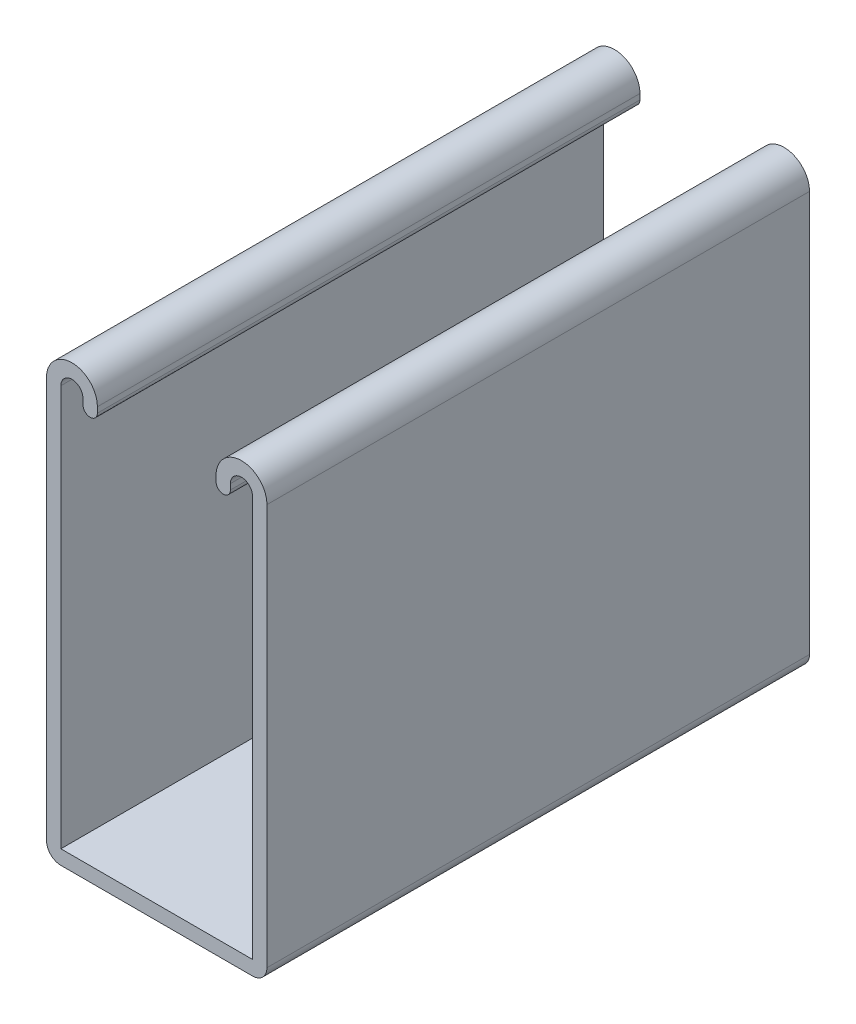
ISO-10303-21;
HEADER;
FILE_DESCRIPTION(('STEP AP214'),'2;1');
FILE_NAME('part.step','',(''),(''),'','','');
FILE_SCHEMA(('AUTOMOTIVE_DESIGN { 1 0 10303 214 1 1 1 1 }'));
ENDSEC;
DATA;
#1=APPLICATION_CONTEXT('core data for automotive mechanical design processes');
#2=APPLICATION_PROTOCOL_DEFINITION('international standard','automotive_design',2000,#1);
#3=PRODUCT_CONTEXT('',#1,'mechanical');
#4=PRODUCT('Part','Part','',(#3));
#5=PRODUCT_RELATED_PRODUCT_CATEGORY('part','',(#4));
#6=PRODUCT_DEFINITION_FORMATION('','',#4);
#7=PRODUCT_DEFINITION_CONTEXT('part definition',#1,'design');
#8=PRODUCT_DEFINITION('design','',#6,#7);
#9=PRODUCT_DEFINITION_SHAPE('','',#8);
#10=(LENGTH_UNIT() NAMED_UNIT(*) SI_UNIT(.MILLI.,.METRE.));
#11=(NAMED_UNIT(*) PLANE_ANGLE_UNIT() SI_UNIT($,.RADIAN.));
#12=(NAMED_UNIT(*) SI_UNIT($,.STERADIAN.) SOLID_ANGLE_UNIT());
#13=UNCERTAINTY_MEASURE_WITH_UNIT(LENGTH_MEASURE(1.E-05),#10,'distance_accuracy_value','');
#14=(GEOMETRIC_REPRESENTATION_CONTEXT(3) GLOBAL_UNCERTAINTY_ASSIGNED_CONTEXT((#13)) GLOBAL_UNIT_ASSIGNED_CONTEXT((#10,
#11,#12)) REPRESENTATION_CONTEXT('',''));
#15=CARTESIAN_POINT('',(0.,0.,0.));
#16=DIRECTION('',(0.,0.,1.));
#17=DIRECTION('',(1.,0.,0.));
#18=AXIS2_PLACEMENT_3D('',#15,#16,#17);
#19=CARTESIAN_POINT('',(-15.875,39.6875,101.6));
#20=DIRECTION('',(0.,0.,-1.));
#21=DIRECTION('',(-1.,0.,0.));
#22=AXIS2_PLACEMENT_3D('',#19,#20,#21);
#23=CYLINDRICAL_SURFACE('',#22,4.7625);
#24=CARTESIAN_POINT('',(-15.875,39.6875,0.));
#25=DIRECTION('',(0.,0.,1.));
#26=DIRECTION('',(-1.,0.,0.));
#27=AXIS2_PLACEMENT_3D('',#24,#25,#26);
#28=CIRCLE('',#27,4.7625);
#29=CARTESIAN_POINT('',(-11.1125,39.6875,0.));
#30=VERTEX_POINT('',#29);
#31=CARTESIAN_POINT('',(-20.6375,39.6875,0.));
#32=VERTEX_POINT('',#31);
#33=EDGE_CURVE('E189',#30,#32,#28,.T.);
#34=ORIENTED_EDGE('',*,*,#33,.T.);
#35=DIRECTION('',(0.,0.,-1.));
#36=VECTOR('',#35,1.);
#37=CARTESIAN_POINT('',(-20.6375,39.6875,101.6));
#38=LINE('',#37,#36);
#39=CARTESIAN_POINT('',(-20.6375,39.6875,101.6));
#40=VERTEX_POINT('',#39);
#41=EDGE_CURVE('E11',#40,#32,#38,.T.);
#42=ORIENTED_EDGE('',*,*,#41,.F.);
#43=CARTESIAN_POINT('',(-15.875,39.6875,101.6));
#44=DIRECTION('',(0.,0.,1.));
#45=DIRECTION('',(-1.,0.,0.));
#46=AXIS2_PLACEMENT_3D('',#43,#44,#45);
#47=CIRCLE('',#46,4.7625);
#48=CARTESIAN_POINT('',(-11.1125,39.6875,101.6));
#49=VERTEX_POINT('',#48);
#50=EDGE_CURVE('E223',#49,#40,#47,.T.);
#51=ORIENTED_EDGE('',*,*,#50,.F.);
#52=DIRECTION('',(0.,0.,-1.));
#53=VECTOR('',#52,1.);
#54=CARTESIAN_POINT('',(-11.1125,39.6875,101.6));
#55=LINE('',#54,#53);
#56=EDGE_CURVE('E185',#49,#30,#55,.T.);
#57=ORIENTED_EDGE('',*,*,#56,.T.);
#58=EDGE_LOOP('',(#34,#42,#51,#57));
#59=FACE_BOUND('',#58,.T.);
#60=ADVANCED_FACE('F32',(#59),#23,.T.);
#61=CARTESIAN_POINT('',(-20.6375,39.6875,101.6));
#62=DIRECTION('',(1.,0.,0.));
#63=DIRECTION('',(0.,1.,0.));
#64=AXIS2_PLACEMENT_3D('',#61,#62,#63);
#65=PLANE('',#64);
#66=DIRECTION('',(0.,-1.,0.));
#67=VECTOR('',#66,1.);
#68=CARTESIAN_POINT('',(-20.6375,39.6875,0.));
#69=LINE('',#68,#67);
#70=CARTESIAN_POINT('',(-20.6375,-35.4076,0.));
#71=VERTEX_POINT('',#70);
#72=EDGE_CURVE('E192',#32,#71,#69,.T.);
#73=ORIENTED_EDGE('',*,*,#72,.T.);
#74=DIRECTION('',(0.,0.,-1.));
#75=VECTOR('',#74,1.);
#76=CARTESIAN_POINT('',(-20.6375,-35.4076,101.6));
#77=LINE('',#76,#75);
#78=CARTESIAN_POINT('',(-20.6375,-35.4076,101.6));
#79=VERTEX_POINT('',#78);
#80=EDGE_CURVE('E41',#79,#71,#77,.T.);
#81=ORIENTED_EDGE('',*,*,#80,.F.);
#82=DIRECTION('',(0.,-1.,0.));
#83=VECTOR('',#82,1.);
#84=CARTESIAN_POINT('',(-20.6375,39.6875,101.6));
#85=LINE('',#84,#83);
#86=EDGE_CURVE('E122',#40,#79,#85,.T.);
#87=ORIENTED_EDGE('',*,*,#86,.F.);
#88=ORIENTED_EDGE('',*,*,#41,.T.);
#89=EDGE_LOOP('',(#73,#81,#87,#88));
#90=FACE_BOUND('',#89,.T.);
#91=ADVANCED_FACE('F332',(#90),#65,.F.);
#92=CARTESIAN_POINT('',(-17.9451,-35.4076,101.6));
#93=DIRECTION('',(0.,0.,-1.));
#94=DIRECTION('',(-1.,0.,0.));
#95=AXIS2_PLACEMENT_3D('',#92,#93,#94);
#96=CYLINDRICAL_SURFACE('',#95,2.6924);
#97=CARTESIAN_POINT('',(-17.9451,-35.4076,0.));
#98=DIRECTION('',(0.,0.,1.));
#99=DIRECTION('',(-1.,0.,0.));
#100=AXIS2_PLACEMENT_3D('',#97,#98,#99);
#101=CIRCLE('',#100,2.6924);
#102=CARTESIAN_POINT('',(-17.9451,-38.1,0.));
#103=VERTEX_POINT('',#102);
#104=EDGE_CURVE('E194',#71,#103,#101,.T.);
#105=ORIENTED_EDGE('',*,*,#104,.T.);
#106=DIRECTION('',(0.,0.,-1.));
#107=VECTOR('',#106,1.);
#108=CARTESIAN_POINT('',(-17.9451,-38.1,101.6));
#109=LINE('',#108,#107);
#110=CARTESIAN_POINT('',(-17.9451,-38.1,101.6));
#111=VERTEX_POINT('',#110);
#112=EDGE_CURVE('E260',#111,#103,#109,.T.);
#113=ORIENTED_EDGE('',*,*,#112,.F.);
#114=CARTESIAN_POINT('',(-17.9451,-35.4076,101.6));
#115=DIRECTION('',(0.,0.,1.));
#116=DIRECTION('',(-1.,0.,0.));
#117=AXIS2_PLACEMENT_3D('',#114,#115,#116);
#118=CIRCLE('',#117,2.6924);
#119=EDGE_CURVE('E269',#79,#111,#118,.T.);
#120=ORIENTED_EDGE('',*,*,#119,.F.);
#121=ORIENTED_EDGE('',*,*,#80,.T.);
#122=EDGE_LOOP('',(#105,#113,#120,#121));
#123=FACE_BOUND('',#122,.T.);
#124=ADVANCED_FACE('F267',(#123),#96,.T.);
#125=CARTESIAN_POINT('',(-17.9451,-38.1,101.6));
#126=DIRECTION('',(0.,1.,0.));
#127=DIRECTION('',(-1.,0.,0.));
#128=AXIS2_PLACEMENT_3D('',#125,#126,#127);
#129=PLANE('',#128);
#130=CARTESIAN_POINT('',(0.,-38.1,71.4375));
#131=DIRECTION('',(0.,-1.,0.));
#132=DIRECTION('',(1.,0.,0.));
#133=AXIS2_PLACEMENT_3D('',#130,#131,#132);
#134=CIRCLE('',#133,7.14375);
#135=CARTESIAN_POINT('',(7.14374999999999,-38.1,71.4375));
#136=VERTEX_POINT('',#135);
#137=EDGE_CURVE('E451',#136,#136,#134,.T.);
#138=ORIENTED_EDGE('',*,*,#137,.F.);
#139=EDGE_LOOP('',(#138));
#140=FACE_BOUND('',#139,.T.);
#141=CARTESIAN_POINT('',(0.,-38.1,23.8125));
#142=DIRECTION('',(0.,-1.,0.));
#143=DIRECTION('',(1.,0.,0.));
#144=AXIS2_PLACEMENT_3D('',#141,#142,#143);
#145=CIRCLE('',#144,7.14375);
#146=CARTESIAN_POINT('',(7.14374999999999,-38.1,23.8125));
#147=VERTEX_POINT('',#146);
#148=EDGE_CURVE('E455',#147,#147,#145,.T.);
#149=ORIENTED_EDGE('',*,*,#148,.F.);
#150=EDGE_LOOP('',(#149));
#151=FACE_BOUND('',#150,.T.);
#152=DIRECTION('',(1.,0.,0.));
#153=VECTOR('',#152,1.);
#154=CARTESIAN_POINT('',(-17.9451,-38.1,0.));
#155=LINE('',#154,#153);
#156=CARTESIAN_POINT('',(17.9451,-38.1,0.));
#157=VERTEX_POINT('',#156);
#158=EDGE_CURVE('E196',#103,#157,#155,.T.);
#159=ORIENTED_EDGE('',*,*,#158,.T.);
#160=DIRECTION('',(0.,0.,-1.));
#161=VECTOR('',#160,1.);
#162=CARTESIAN_POINT('',(17.9451,-38.1,101.6));
#163=LINE('',#162,#161);
#164=CARTESIAN_POINT('',(17.9451,-38.1,101.6));
#165=VERTEX_POINT('',#164);
#166=EDGE_CURVE('E257',#165,#157,#163,.T.);
#167=ORIENTED_EDGE('',*,*,#166,.F.);
#168=DIRECTION('',(1.,0.,0.));
#169=VECTOR('',#168,1.);
#170=CARTESIAN_POINT('',(-17.9451,-38.1,101.6));
#171=LINE('',#170,#169);
#172=EDGE_CURVE('E287',#111,#165,#171,.T.);
#173=ORIENTED_EDGE('',*,*,#172,.F.);
#174=ORIENTED_EDGE('',*,*,#112,.T.);
#175=EDGE_LOOP('',(#159,#167,#173,#174));
#176=FACE_BOUND('',#175,.T.);
#177=ADVANCED_FACE('F278',(#140,#151,#176),#129,.F.);
#178=CARTESIAN_POINT('',(17.9451,-35.4076,101.6));
#179=DIRECTION('',(0.,0.,-1.));
#180=DIRECTION('',(-1.,0.,0.));
#181=AXIS2_PLACEMENT_3D('',#178,#179,#180);
#182=CYLINDRICAL_SURFACE('',#181,2.6924);
#183=CARTESIAN_POINT('',(17.9451,-35.4076,0.));
#184=DIRECTION('',(0.,0.,1.));
#185=DIRECTION('',(1.,0.,0.));
#186=AXIS2_PLACEMENT_3D('',#183,#184,#185);
#187=CIRCLE('',#186,2.6924);
#188=CARTESIAN_POINT('',(20.6375,-35.4076,0.));
#189=VERTEX_POINT('',#188);
#190=EDGE_CURVE('E198',#157,#189,#187,.T.);
#191=ORIENTED_EDGE('',*,*,#190,.T.);
#192=DIRECTION('',(0.,0.,-1.));
#193=VECTOR('',#192,1.);
#194=CARTESIAN_POINT('',(20.6375,-35.4076,101.6));
#195=LINE('',#194,#193);
#196=CARTESIAN_POINT('',(20.6375,-35.4076,101.6));
#197=VERTEX_POINT('',#196);
#198=EDGE_CURVE('E254',#197,#189,#195,.T.);
#199=ORIENTED_EDGE('',*,*,#198,.F.);
#200=CARTESIAN_POINT('',(17.9451,-35.4076,101.6));
#201=DIRECTION('',(0.,0.,1.));
#202=DIRECTION('',(1.,0.,0.));
#203=AXIS2_PLACEMENT_3D('',#200,#201,#202);
#204=CIRCLE('',#203,2.6924);
#205=EDGE_CURVE('E284',#165,#197,#204,.T.);
#206=ORIENTED_EDGE('',*,*,#205,.F.);
#207=ORIENTED_EDGE('',*,*,#166,.T.);
#208=EDGE_LOOP('',(#191,#199,#206,#207));
#209=FACE_BOUND('',#208,.T.);
#210=ADVANCED_FACE('F282',(#209),#182,.T.);
#211=CARTESIAN_POINT('',(20.6375,-35.4076,101.6));
#212=DIRECTION('',(-1.,0.,0.));
#213=DIRECTION('',(0.,-1.,0.));
#214=AXIS2_PLACEMENT_3D('',#211,#212,#213);
#215=PLANE('',#214);
#216=DIRECTION('',(0.,1.,0.));
#217=VECTOR('',#216,1.);
#218=CARTESIAN_POINT('',(20.6375,-35.4076,0.));
#219=LINE('',#218,#217);
#220=CARTESIAN_POINT('',(20.6375,39.6875,0.));
#221=VERTEX_POINT('',#220);
#222=EDGE_CURVE('E200',#189,#221,#219,.T.);
#223=ORIENTED_EDGE('',*,*,#222,.T.);
#224=DIRECTION('',(0.,0.,-1.));
#225=VECTOR('',#224,1.);
#226=CARTESIAN_POINT('',(20.6375,39.6875,101.6));
#227=LINE('',#226,#225);
#228=CARTESIAN_POINT('',(20.6375,39.6875,101.6));
#229=VERTEX_POINT('',#228);
#230=EDGE_CURVE('E251',#229,#221,#227,.T.);
#231=ORIENTED_EDGE('',*,*,#230,.F.);
#232=DIRECTION('',(0.,1.,0.));
#233=VECTOR('',#232,1.);
#234=CARTESIAN_POINT('',(20.6375,-35.4076,101.6));
#235=LINE('',#234,#233);
#236=EDGE_CURVE('E286',#197,#229,#235,.T.);
#237=ORIENTED_EDGE('',*,*,#236,.F.);
#238=ORIENTED_EDGE('',*,*,#198,.T.);
#239=EDGE_LOOP('',(#223,#231,#237,#238));
#240=FACE_BOUND('',#239,.T.);
#241=ADVANCED_FACE('F346',(#240),#215,.F.);
#242=CARTESIAN_POINT('',(15.875,39.6875,101.6));
#243=DIRECTION('',(0.,0.,-1.));
#244=DIRECTION('',(-1.,0.,0.));
#245=AXIS2_PLACEMENT_3D('',#242,#243,#244);
#246=CYLINDRICAL_SURFACE('',#245,4.7625);
#247=CARTESIAN_POINT('',(15.875,39.6875,0.));
#248=DIRECTION('',(0.,0.,1.));
#249=DIRECTION('',(1.,0.,0.));
#250=AXIS2_PLACEMENT_3D('',#247,#248,#249);
#251=CIRCLE('',#250,4.7625);
#252=CARTESIAN_POINT('',(11.1125,39.6875,0.));
#253=VERTEX_POINT('',#252);
#254=EDGE_CURVE('E202',#221,#253,#251,.T.);
#255=ORIENTED_EDGE('',*,*,#254,.T.);
#256=DIRECTION('',(0.,0.,-1.));
#257=VECTOR('',#256,1.);
#258=CARTESIAN_POINT('',(11.1125,39.6875,101.6));
#259=LINE('',#258,#257);
#260=CARTESIAN_POINT('',(11.1125,39.6875,101.6));
#261=VERTEX_POINT('',#260);
#262=EDGE_CURVE('E248',#261,#253,#259,.T.);
#263=ORIENTED_EDGE('',*,*,#262,.F.);
#264=CARTESIAN_POINT('',(15.875,39.6875,101.6));
#265=DIRECTION('',(0.,0.,1.));
#266=DIRECTION('',(1.,0.,0.));
#267=AXIS2_PLACEMENT_3D('',#264,#265,#266);
#268=CIRCLE('',#267,4.7625);
#269=EDGE_CURVE('E289',#229,#261,#268,.T.);
#270=ORIENTED_EDGE('',*,*,#269,.F.);
#271=ORIENTED_EDGE('',*,*,#230,.T.);
#272=EDGE_LOOP('',(#255,#263,#270,#271));
#273=FACE_BOUND('',#272,.T.);
#274=ADVANCED_FACE('F349',(#273),#246,.T.);
#275=CARTESIAN_POINT('',(11.1125,39.6875,101.6));
#276=DIRECTION('',(1.,0.,0.));
#277=DIRECTION('',(0.,1.,0.));
#278=AXIS2_PLACEMENT_3D('',#275,#276,#277);
#279=PLANE('',#278);
#280=DIRECTION('',(0.,-1.,0.));
#281=VECTOR('',#280,1.);
#282=CARTESIAN_POINT('',(11.1125,39.6875,0.));
#283=LINE('',#282,#281);
#284=CARTESIAN_POINT('',(11.1125,38.65245,0.));
#285=VERTEX_POINT('',#284);
#286=EDGE_CURVE('E204',#253,#285,#283,.T.);
#287=ORIENTED_EDGE('',*,*,#286,.T.);
#288=DIRECTION('',(0.,0.,-1.));
#289=VECTOR('',#288,1.);
#290=CARTESIAN_POINT('',(11.1125,38.65245,101.6));
#291=LINE('',#290,#289);
#292=CARTESIAN_POINT('',(11.1125,38.65245,101.6));
#293=VERTEX_POINT('',#292);
#294=EDGE_CURVE('E245',#293,#285,#291,.T.);
#295=ORIENTED_EDGE('',*,*,#294,.F.);
#296=DIRECTION('',(0.,-1.,0.));
#297=VECTOR('',#296,1.);
#298=CARTESIAN_POINT('',(11.1125,39.6875,101.6));
#299=LINE('',#298,#297);
#300=EDGE_CURVE('E295',#261,#293,#299,.T.);
#301=ORIENTED_EDGE('',*,*,#300,.F.);
#302=ORIENTED_EDGE('',*,*,#262,.T.);
#303=EDGE_LOOP('',(#287,#295,#301,#302));
#304=FACE_BOUND('',#303,.T.);
#305=ADVANCED_FACE('F353',(#304),#279,.F.);
#306=CARTESIAN_POINT('',(12.4587,38.65245,101.6));
#307=DIRECTION('',(0.,0.,-1.));
#308=DIRECTION('',(-1.,0.,0.));
#309=AXIS2_PLACEMENT_3D('',#306,#307,#308);
#310=CYLINDRICAL_SURFACE('',#309,1.3462);
#311=CARTESIAN_POINT('',(12.4587,38.65245,0.));
#312=DIRECTION('',(0.,0.,1.));
#313=DIRECTION('',(1.,0.,0.));
#314=AXIS2_PLACEMENT_3D('',#311,#312,#313);
#315=CIRCLE('',#314,1.3462);
#316=CARTESIAN_POINT('',(13.8049,38.65245,0.));
#317=VERTEX_POINT('',#316);
#318=EDGE_CURVE('E206',#285,#317,#315,.T.);
#319=ORIENTED_EDGE('',*,*,#318,.T.);
#320=DIRECTION('',(0.,0.,-1.));
#321=VECTOR('',#320,1.);
#322=CARTESIAN_POINT('',(13.8049,38.65245,101.6));
#323=LINE('',#322,#321);
#324=CARTESIAN_POINT('',(13.8049,38.65245,101.6));
#325=VERTEX_POINT('',#324);
#326=EDGE_CURVE('E242',#325,#317,#323,.T.);
#327=ORIENTED_EDGE('',*,*,#326,.F.);
#328=CARTESIAN_POINT('',(12.4587,38.65245,101.6));
#329=DIRECTION('',(0.,0.,1.));
#330=DIRECTION('',(1.,0.,0.));
#331=AXIS2_PLACEMENT_3D('',#328,#329,#330);
#332=CIRCLE('',#331,1.3462);
#333=EDGE_CURVE('E297',#293,#325,#332,.T.);
#334=ORIENTED_EDGE('',*,*,#333,.F.);
#335=ORIENTED_EDGE('',*,*,#294,.T.);
#336=EDGE_LOOP('',(#319,#327,#334,#335));
#337=FACE_BOUND('',#336,.T.);
#338=ADVANCED_FACE('F357',(#337),#310,.T.);
#339=CARTESIAN_POINT('',(13.8049,39.6875,101.6));
#340=DIRECTION('',(-1.,0.,0.));
#341=DIRECTION('',(0.,0.,1.));
#342=AXIS2_PLACEMENT_3D('',#339,#340,#341);
#343=PLANE('',#342);
#344=DIRECTION('',(0.,1.,0.));
#345=VECTOR('',#344,1.);
#346=CARTESIAN_POINT('',(13.8049,39.6875,0.));
#347=LINE('',#346,#345);
#348=CARTESIAN_POINT('',(13.8049,39.6875,0.));
#349=VERTEX_POINT('',#348);
#350=EDGE_CURVE('E208',#317,#349,#347,.T.);
#351=ORIENTED_EDGE('',*,*,#350,.T.);
#352=DIRECTION('',(0.,0.,-1.));
#353=VECTOR('',#352,1.);
#354=CARTESIAN_POINT('',(13.8049,39.6875,101.6));
#355=LINE('',#354,#353);
#356=CARTESIAN_POINT('',(13.8049,39.6875,101.6));
#357=VERTEX_POINT('',#356);
#358=EDGE_CURVE('E239',#357,#349,#355,.T.);
#359=ORIENTED_EDGE('',*,*,#358,.F.);
#360=DIRECTION('',(0.,1.,0.));
#361=VECTOR('',#360,1.);
#362=CARTESIAN_POINT('',(13.8049,39.6875,101.6));
#363=LINE('',#362,#361);
#364=EDGE_CURVE('E299',#325,#357,#363,.T.);
#365=ORIENTED_EDGE('',*,*,#364,.F.);
#366=ORIENTED_EDGE('',*,*,#326,.T.);
#367=EDGE_LOOP('',(#351,#359,#365,#366));
#368=FACE_BOUND('',#367,.T.);
#369=ADVANCED_FACE('F361',(#368),#343,.F.);
#370=CARTESIAN_POINT('',(15.875,39.6875,101.6));
#371=DIRECTION('',(0.,0.,-1.));
#372=DIRECTION('',(-1.,0.,0.));
#373=AXIS2_PLACEMENT_3D('',#370,#371,#372);
#374=CYLINDRICAL_SURFACE('',#373,2.07010000000001);
#375=CARTESIAN_POINT('',(15.875,39.6875,0.));
#376=DIRECTION('',(0.,0.,-1.));
#377=DIRECTION('',(1.,0.,0.));
#378=AXIS2_PLACEMENT_3D('',#375,#376,#377);
#379=CIRCLE('',#378,2.07010000000001);
#380=CARTESIAN_POINT('',(17.9451,39.6875,0.));
#381=VERTEX_POINT('',#380);
#382=EDGE_CURVE('E210',#349,#381,#379,.T.);
#383=ORIENTED_EDGE('',*,*,#382,.T.);
#384=DIRECTION('',(0.,0.,-1.));
#385=VECTOR('',#384,1.);
#386=CARTESIAN_POINT('',(17.9451,39.6875,101.6));
#387=LINE('',#386,#385);
#388=CARTESIAN_POINT('',(17.9451,39.6875,101.6));
#389=VERTEX_POINT('',#388);
#390=EDGE_CURVE('E236',#389,#381,#387,.T.);
#391=ORIENTED_EDGE('',*,*,#390,.F.);
#392=CARTESIAN_POINT('',(15.875,39.6875,101.6));
#393=DIRECTION('',(0.,0.,-1.));
#394=DIRECTION('',(1.,0.,0.));
#395=AXIS2_PLACEMENT_3D('',#392,#393,#394);
#396=CIRCLE('',#395,2.07010000000001);
#397=EDGE_CURVE('E301',#357,#389,#396,.T.);
#398=ORIENTED_EDGE('',*,*,#397,.F.);
#399=ORIENTED_EDGE('',*,*,#358,.T.);
#400=EDGE_LOOP('',(#383,#391,#398,#399));
#401=FACE_BOUND('',#400,.T.);
#402=ADVANCED_FACE('F365',(#401),#374,.F.);
#403=CARTESIAN_POINT('',(17.9451,-35.4076,101.6));
#404=DIRECTION('',(1.,0.,0.));
#405=DIRECTION('',(0.,0.,-1.));
#406=AXIS2_PLACEMENT_3D('',#403,#404,#405);
#407=PLANE('',#406);
#408=DIRECTION('',(0.,-1.,0.));
#409=VECTOR('',#408,1.);
#410=CARTESIAN_POINT('',(17.9451,-35.4076,0.));
#411=LINE('',#410,#409);
#412=CARTESIAN_POINT('',(17.9451,-35.4076,0.));
#413=VERTEX_POINT('',#412);
#414=EDGE_CURVE('E212',#381,#413,#411,.T.);
#415=ORIENTED_EDGE('',*,*,#414,.T.);
#416=DIRECTION('',(0.,0.,-1.));
#417=VECTOR('',#416,1.);
#418=CARTESIAN_POINT('',(17.9451,-35.4076,101.6));
#419=LINE('',#418,#417);
#420=CARTESIAN_POINT('',(17.9451,-35.4076,101.6));
#421=VERTEX_POINT('',#420);
#422=EDGE_CURVE('E233',#421,#413,#419,.T.);
#423=ORIENTED_EDGE('',*,*,#422,.F.);
#424=DIRECTION('',(0.,-1.,0.));
#425=VECTOR('',#424,1.);
#426=CARTESIAN_POINT('',(17.9451,-35.4076,101.6));
#427=LINE('',#426,#425);
#428=EDGE_CURVE('E303',#389,#421,#427,.T.);
#429=ORIENTED_EDGE('',*,*,#428,.F.);
#430=ORIENTED_EDGE('',*,*,#390,.T.);
#431=EDGE_LOOP('',(#415,#423,#429,#430));
#432=FACE_BOUND('',#431,.T.);
#433=ADVANCED_FACE('F369',(#432),#407,.F.);
#434=CARTESIAN_POINT('',(-17.9451,-35.4076,101.6));
#435=DIRECTION('',(0.,-1.,0.));
#436=DIRECTION('',(0.,0.,-1.));
#437=AXIS2_PLACEMENT_3D('',#434,#435,#436);
#438=PLANE('',#437);
#439=CARTESIAN_POINT('',(0.,-35.4076,71.4375));
#440=DIRECTION('',(0.,-1.,0.));
#441=DIRECTION('',(0.,0.,-1.));
#442=AXIS2_PLACEMENT_3D('',#439,#440,#441);
#443=CIRCLE('',#442,7.14375);
#444=CARTESIAN_POINT('',(0.,-35.4076,64.29375));
#445=VERTEX_POINT('',#444);
#446=EDGE_CURVE('E454',#445,#445,#443,.T.);
#447=ORIENTED_EDGE('',*,*,#446,.T.);
#448=EDGE_LOOP('',(#447));
#449=FACE_BOUND('',#448,.T.);
#450=CARTESIAN_POINT('',(0.,-35.4076,23.8125));
#451=DIRECTION('',(0.,-1.,0.));
#452=DIRECTION('',(0.,0.,-1.));
#453=AXIS2_PLACEMENT_3D('',#450,#451,#452);
#454=CIRCLE('',#453,7.14375);
#455=CARTESIAN_POINT('',(0.,-35.4076,16.66875));
#456=VERTEX_POINT('',#455);
#457=EDGE_CURVE('E35',#456,#456,#454,.T.);
#458=ORIENTED_EDGE('',*,*,#457,.T.);
#459=EDGE_LOOP('',(#458));
#460=FACE_BOUND('',#459,.T.);
#461=DIRECTION('',(-1.,0.,0.));
#462=VECTOR('',#461,1.);
#463=CARTESIAN_POINT('',(-17.9451,-35.4076,0.));
#464=LINE('',#463,#462);
#465=CARTESIAN_POINT('',(-17.9451,-35.4076,0.));
#466=VERTEX_POINT('',#465);
#467=EDGE_CURVE('E214',#413,#466,#464,.T.);
#468=ORIENTED_EDGE('',*,*,#467,.T.);
#469=DIRECTION('',(0.,0.,-1.));
#470=VECTOR('',#469,1.);
#471=CARTESIAN_POINT('',(-17.9451,-35.4076,101.6));
#472=LINE('',#471,#470);
#473=CARTESIAN_POINT('',(-17.9451,-35.4076,101.6));
#474=VERTEX_POINT('',#473);
#475=EDGE_CURVE('E230',#474,#466,#472,.T.);
#476=ORIENTED_EDGE('',*,*,#475,.F.);
#477=DIRECTION('',(-1.,0.,0.));
#478=VECTOR('',#477,1.);
#479=CARTESIAN_POINT('',(-17.9451,-35.4076,101.6));
#480=LINE('',#479,#478);
#481=EDGE_CURVE('E305',#421,#474,#480,.T.);
#482=ORIENTED_EDGE('',*,*,#481,.F.);
#483=ORIENTED_EDGE('',*,*,#422,.T.);
#484=EDGE_LOOP('',(#468,#476,#482,#483));
#485=FACE_BOUND('',#484,.T.);
#486=ADVANCED_FACE('F373',(#449,#460,#485),#438,.F.);
#487=CARTESIAN_POINT('',(-17.9451,39.6875,101.6));
#488=DIRECTION('',(-1.,0.,0.));
#489=DIRECTION('',(0.,-1.,0.));
#490=AXIS2_PLACEMENT_3D('',#487,#488,#489);
#491=PLANE('',#490);
#492=DIRECTION('',(0.,1.,0.));
#493=VECTOR('',#492,1.);
#494=CARTESIAN_POINT('',(-17.9451,39.6875,0.));
#495=LINE('',#494,#493);
#496=CARTESIAN_POINT('',(-17.9451,39.6875,0.));
#497=VERTEX_POINT('',#496);
#498=EDGE_CURVE('E216',#466,#497,#495,.T.);
#499=ORIENTED_EDGE('',*,*,#498,.T.);
#500=DIRECTION('',(0.,0.,-1.));
#501=VECTOR('',#500,1.);
#502=CARTESIAN_POINT('',(-17.9451,39.6875,101.6));
#503=LINE('',#502,#501);
#504=CARTESIAN_POINT('',(-17.9451,39.6875,101.6));
#505=VERTEX_POINT('',#504);
#506=EDGE_CURVE('E227',#505,#497,#503,.T.);
#507=ORIENTED_EDGE('',*,*,#506,.F.);
#508=DIRECTION('',(0.,1.,0.));
#509=VECTOR('',#508,1.);
#510=CARTESIAN_POINT('',(-17.9451,39.6875,101.6));
#511=LINE('',#510,#509);
#512=EDGE_CURVE('E307',#474,#505,#511,.T.);
#513=ORIENTED_EDGE('',*,*,#512,.F.);
#514=ORIENTED_EDGE('',*,*,#475,.T.);
#515=EDGE_LOOP('',(#499,#507,#513,#514));
#516=FACE_BOUND('',#515,.T.);
#517=ADVANCED_FACE('F313',(#516),#491,.F.);
#518=CARTESIAN_POINT('',(-15.875,39.6875,101.6));
#519=DIRECTION('',(0.,0.,-1.));
#520=DIRECTION('',(-1.,0.,0.));
#521=AXIS2_PLACEMENT_3D('',#518,#519,#520);
#522=CYLINDRICAL_SURFACE('',#521,2.0701);
#523=CARTESIAN_POINT('',(-15.875,39.6875,0.));
#524=DIRECTION('',(0.,0.,-1.));
#525=DIRECTION('',(-1.,0.,0.));
#526=AXIS2_PLACEMENT_3D('',#523,#524,#525);
#527=CIRCLE('',#526,2.0701);
#528=CARTESIAN_POINT('',(-13.8049,39.6875,0.));
#529=VERTEX_POINT('',#528);
#530=EDGE_CURVE('E218',#497,#529,#527,.T.);
#531=ORIENTED_EDGE('',*,*,#530,.T.);
#532=DIRECTION('',(0.,0.,-1.));
#533=VECTOR('',#532,1.);
#534=CARTESIAN_POINT('',(-13.8049,39.6875,101.6));
#535=LINE('',#534,#533);
#536=CARTESIAN_POINT('',(-13.8049,39.6875,101.6));
#537=VERTEX_POINT('',#536);
#538=EDGE_CURVE('E180',#537,#529,#535,.T.);
#539=ORIENTED_EDGE('',*,*,#538,.F.);
#540=CARTESIAN_POINT('',(-15.875,39.6875,101.6));
#541=DIRECTION('',(0.,0.,-1.));
#542=DIRECTION('',(-1.,0.,0.));
#543=AXIS2_PLACEMENT_3D('',#540,#541,#542);
#544=CIRCLE('',#543,2.0701);
#545=EDGE_CURVE('E171',#505,#537,#544,.T.);
#546=ORIENTED_EDGE('',*,*,#545,.F.);
#547=ORIENTED_EDGE('',*,*,#506,.T.);
#548=EDGE_LOOP('',(#531,#539,#546,#547));
#549=FACE_BOUND('',#548,.T.);
#550=ADVANCED_FACE('F317',(#549),#522,.F.);
#551=CARTESIAN_POINT('',(-13.8049,39.6875,101.6));
#552=DIRECTION('',(1.,0.,0.));
#553=DIRECTION('',(0.,1.,0.));
#554=AXIS2_PLACEMENT_3D('',#551,#552,#553);
#555=PLANE('',#554);
#556=DIRECTION('',(0.,-1.,0.));
#557=VECTOR('',#556,1.);
#558=CARTESIAN_POINT('',(-13.8049,39.6875,0.));
#559=LINE('',#558,#557);
#560=CARTESIAN_POINT('',(-13.8049,38.65245,0.));
#561=VERTEX_POINT('',#560);
#562=EDGE_CURVE('E179',#529,#561,#559,.T.);
#563=ORIENTED_EDGE('',*,*,#562,.T.);
#564=DIRECTION('',(0.,0.,-1.));
#565=VECTOR('',#564,1.);
#566=CARTESIAN_POINT('',(-13.8049,38.65245,101.6));
#567=LINE('',#566,#565);
#568=CARTESIAN_POINT('',(-13.8049,38.65245,101.6));
#569=VERTEX_POINT('',#568);
#570=EDGE_CURVE('E176',#569,#561,#567,.T.);
#571=ORIENTED_EDGE('',*,*,#570,.F.);
#572=DIRECTION('',(0.,-1.,0.));
#573=VECTOR('',#572,1.);
#574=CARTESIAN_POINT('',(-13.8049,39.6875,101.6));
#575=LINE('',#574,#573);
#576=EDGE_CURVE('E165',#537,#569,#575,.T.);
#577=ORIENTED_EDGE('',*,*,#576,.F.);
#578=ORIENTED_EDGE('',*,*,#538,.T.);
#579=EDGE_LOOP('',(#563,#571,#577,#578));
#580=FACE_BOUND('',#579,.T.);
#581=ADVANCED_FACE('F177',(#580),#555,.F.);
#582=CARTESIAN_POINT('',(-12.4587,38.65245,101.6));
#583=DIRECTION('',(0.,0.,-1.));
#584=DIRECTION('',(-1.,0.,0.));
#585=AXIS2_PLACEMENT_3D('',#582,#583,#584);
#586=CYLINDRICAL_SURFACE('',#585,1.3462);
#587=CARTESIAN_POINT('',(-12.4587,38.65245,0.));
#588=DIRECTION('',(0.,0.,1.));
#589=DIRECTION('',(-1.,0.,0.));
#590=AXIS2_PLACEMENT_3D('',#587,#588,#589);
#591=CIRCLE('',#590,1.3462);
#592=CARTESIAN_POINT('',(-11.1125,38.65245,0.));
#593=VERTEX_POINT('',#592);
#594=EDGE_CURVE('E108',#561,#593,#591,.T.);
#595=ORIENTED_EDGE('',*,*,#594,.T.);
#596=DIRECTION('',(0.,0.,-1.));
#597=VECTOR('',#596,1.);
#598=CARTESIAN_POINT('',(-11.1125,38.65245,101.6));
#599=LINE('',#598,#597);
#600=CARTESIAN_POINT('',(-11.1125,38.65245,101.6));
#601=VERTEX_POINT('',#600);
#602=EDGE_CURVE('E181',#601,#593,#599,.T.);
#603=ORIENTED_EDGE('',*,*,#602,.F.);
#604=CARTESIAN_POINT('',(-12.4587,38.65245,101.6));
#605=DIRECTION('',(0.,0.,1.));
#606=DIRECTION('',(-1.,0.,0.));
#607=AXIS2_PLACEMENT_3D('',#604,#605,#606);
#608=CIRCLE('',#607,1.3462);
#609=EDGE_CURVE('E169',#569,#601,#608,.T.);
#610=ORIENTED_EDGE('',*,*,#609,.F.);
#611=ORIENTED_EDGE('',*,*,#570,.T.);
#612=EDGE_LOOP('',(#595,#603,#610,#611));
#613=FACE_BOUND('',#612,.T.);
#614=ADVANCED_FACE('F183',(#613),#586,.T.);
#615=CARTESIAN_POINT('',(-11.1125,39.6875,101.6));
#616=DIRECTION('',(-1.,0.,0.));
#617=DIRECTION('',(0.,-1.,0.));
#618=AXIS2_PLACEMENT_3D('',#615,#616,#617);
#619=PLANE('',#618);
#620=DIRECTION('',(0.,1.,0.));
#621=VECTOR('',#620,1.);
#622=CARTESIAN_POINT('',(-11.1125,39.6875,0.));
#623=LINE('',#622,#621);
#624=EDGE_CURVE('E114',#593,#30,#623,.T.);
#625=ORIENTED_EDGE('',*,*,#624,.T.);
#626=ORIENTED_EDGE('',*,*,#56,.F.);
#627=DIRECTION('',(0.,1.,0.));
#628=VECTOR('',#627,1.);
#629=CARTESIAN_POINT('',(-11.1125,39.6875,101.6));
#630=LINE('',#629,#628);
#631=EDGE_CURVE('E49',#601,#49,#630,.T.);
#632=ORIENTED_EDGE('',*,*,#631,.F.);
#633=ORIENTED_EDGE('',*,*,#602,.T.);
#634=EDGE_LOOP('',(#625,#626,#632,#633));
#635=FACE_BOUND('',#634,.T.);
#636=ADVANCED_FACE('F321',(#635),#619,.F.);
#637=CARTESIAN_POINT('',(-15.875,39.6875,101.6));
#638=DIRECTION('',(0.,0.,-1.));
#639=DIRECTION('',(-1.,0.,0.));
#640=AXIS2_PLACEMENT_3D('',#637,#638,#639);
#641=PLANE('',#640);
#642=ORIENTED_EDGE('',*,*,#50,.T.);
#643=ORIENTED_EDGE('',*,*,#86,.T.);
#644=ORIENTED_EDGE('',*,*,#119,.T.);
#645=ORIENTED_EDGE('',*,*,#172,.T.);
#646=ORIENTED_EDGE('',*,*,#205,.T.);
#647=ORIENTED_EDGE('',*,*,#236,.T.);
#648=ORIENTED_EDGE('',*,*,#269,.T.);
#649=ORIENTED_EDGE('',*,*,#300,.T.);
#650=ORIENTED_EDGE('',*,*,#333,.T.);
#651=ORIENTED_EDGE('',*,*,#364,.T.);
#652=ORIENTED_EDGE('',*,*,#397,.T.);
#653=ORIENTED_EDGE('',*,*,#428,.T.);
#654=ORIENTED_EDGE('',*,*,#481,.T.);
#655=ORIENTED_EDGE('',*,*,#512,.T.);
#656=ORIENTED_EDGE('',*,*,#545,.T.);
#657=ORIENTED_EDGE('',*,*,#576,.T.);
#658=ORIENTED_EDGE('',*,*,#609,.T.);
#659=ORIENTED_EDGE('',*,*,#631,.T.);
#660=EDGE_LOOP('',(#642,#643,#644,#645,#646,#647,#648,#649,#650,#651,#652,#653,#654,#655,#656,
#657,#658,#659));
#661=FACE_BOUND('',#660,.T.);
#662=ADVANCED_FACE('F167',(#661),#641,.F.);
#663=CARTESIAN_POINT('',(-15.875,39.6875,0.));
#664=DIRECTION('',(0.,0.,-1.));
#665=DIRECTION('',(-1.,0.,0.));
#666=AXIS2_PLACEMENT_3D('',#663,#664,#665);
#667=PLANE('',#666);
#668=ORIENTED_EDGE('',*,*,#33,.F.);
#669=ORIENTED_EDGE('',*,*,#624,.F.);
#670=ORIENTED_EDGE('',*,*,#594,.F.);
#671=ORIENTED_EDGE('',*,*,#562,.F.);
#672=ORIENTED_EDGE('',*,*,#530,.F.);
#673=ORIENTED_EDGE('',*,*,#498,.F.);
#674=ORIENTED_EDGE('',*,*,#467,.F.);
#675=ORIENTED_EDGE('',*,*,#414,.F.);
#676=ORIENTED_EDGE('',*,*,#382,.F.);
#677=ORIENTED_EDGE('',*,*,#350,.F.);
#678=ORIENTED_EDGE('',*,*,#318,.F.);
#679=ORIENTED_EDGE('',*,*,#286,.F.);
#680=ORIENTED_EDGE('',*,*,#254,.F.);
#681=ORIENTED_EDGE('',*,*,#222,.F.);
#682=ORIENTED_EDGE('',*,*,#190,.F.);
#683=ORIENTED_EDGE('',*,*,#158,.F.);
#684=ORIENTED_EDGE('',*,*,#104,.F.);
#685=ORIENTED_EDGE('',*,*,#72,.F.);
#686=EDGE_LOOP('',(#668,#669,#670,#671,#672,#673,#674,#675,#676,#677,#678,#679,#680,#681,#682,
#683,#684,#685));
#687=FACE_BOUND('',#686,.T.);
#688=ADVANCED_FACE('F273',(#687),#667,.T.);
#689=CARTESIAN_POINT('',(0.,44.45,23.8125));
#690=DIRECTION('',(0.,-1.,0.));
#691=DIRECTION('',(1.,0.,0.));
#692=AXIS2_PLACEMENT_3D('',#689,#690,#691);
#693=CYLINDRICAL_SURFACE('',#692,7.14375);
#694=ORIENTED_EDGE('',*,*,#148,.T.);
#695=EDGE_LOOP('',(#694));
#696=FACE_BOUND('',#695,.T.);
#697=ORIENTED_EDGE('',*,*,#457,.F.);
#698=EDGE_LOOP('',(#697));
#699=FACE_BOUND('',#698,.T.);
#700=ADVANCED_FACE('F410',(#696,#699),#693,.F.);
#701=CARTESIAN_POINT('',(0.,44.45,71.4375));
#702=DIRECTION('',(0.,-1.,0.));
#703=DIRECTION('',(1.,0.,0.));
#704=AXIS2_PLACEMENT_3D('',#701,#702,#703);
#705=CYLINDRICAL_SURFACE('',#704,7.14375);
#706=ORIENTED_EDGE('',*,*,#137,.T.);
#707=EDGE_LOOP('',(#706));
#708=FACE_BOUND('',#707,.T.);
#709=ORIENTED_EDGE('',*,*,#446,.F.);
#710=EDGE_LOOP('',(#709));
#711=FACE_BOUND('',#710,.T.);
#712=ADVANCED_FACE('F418',(#708,#711),#705,.F.);
#713=CLOSED_SHELL('',(#60,#91,#124,#177,#210,#241,#274,#305,#338,#369,#402,#433,#486,#517,#550,
#581,#614,#636,#662,#688,#700,#712));
#714=MANIFOLD_SOLID_BREP('B2',#713);
#715=ADVANCED_BREP_SHAPE_REPRESENTATION('',(#18,#714),#14);
#716=SHAPE_DEFINITION_REPRESENTATION(#9,#715);
ENDSEC;
END-ISO-10303-21;
